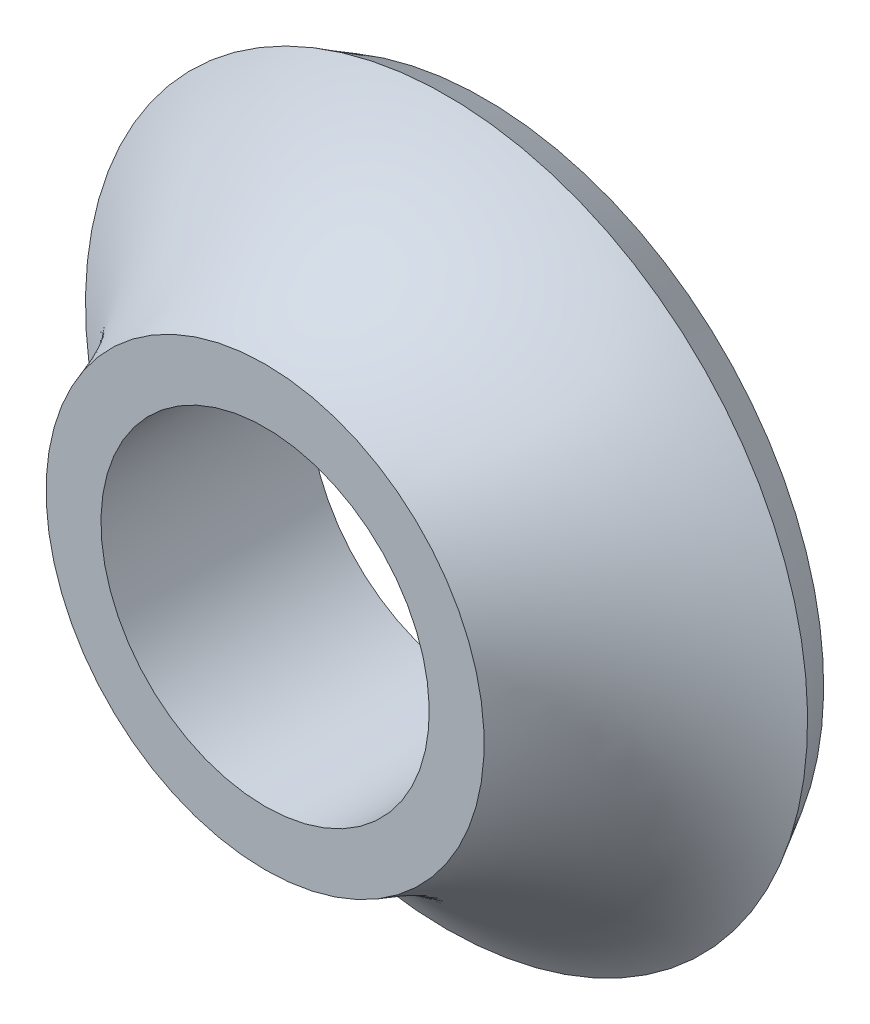
ISO-10303-21;
HEADER;
FILE_DESCRIPTION(('STEP AP214'),'2;1');
FILE_NAME('part.step','',(''),(''),'','','');
FILE_SCHEMA(('AUTOMOTIVE_DESIGN { 1 0 10303 214 1 1 1 1 }'));
ENDSEC;
DATA;
#1=APPLICATION_CONTEXT('core data for automotive mechanical design processes');
#2=APPLICATION_PROTOCOL_DEFINITION('international standard','automotive_design',2000,#1);
#3=PRODUCT_CONTEXT('',#1,'mechanical');
#4=PRODUCT('Part','Part','',(#3));
#5=PRODUCT_RELATED_PRODUCT_CATEGORY('part','',(#4));
#6=PRODUCT_DEFINITION_FORMATION('','',#4);
#7=PRODUCT_DEFINITION_CONTEXT('part definition',#1,'design');
#8=PRODUCT_DEFINITION('design','',#6,#7);
#9=PRODUCT_DEFINITION_SHAPE('','',#8);
#10=(LENGTH_UNIT() NAMED_UNIT(*) SI_UNIT(.MILLI.,.METRE.));
#11=(NAMED_UNIT(*) PLANE_ANGLE_UNIT() SI_UNIT($,.RADIAN.));
#12=(NAMED_UNIT(*) SI_UNIT($,.STERADIAN.) SOLID_ANGLE_UNIT());
#13=UNCERTAINTY_MEASURE_WITH_UNIT(LENGTH_MEASURE(1.E-05),#10,'distance_accuracy_value','');
#14=(GEOMETRIC_REPRESENTATION_CONTEXT(3) GLOBAL_UNCERTAINTY_ASSIGNED_CONTEXT((#13)) GLOBAL_UNIT_ASSIGNED_CONTEXT((#10,
#11,#12)) REPRESENTATION_CONTEXT('',''));
#15=CARTESIAN_POINT('',(0.,0.,0.));
#16=DIRECTION('',(0.,0.,1.));
#17=DIRECTION('',(1.,0.,0.));
#18=AXIS2_PLACEMENT_3D('',#15,#16,#17);
#19=CARTESIAN_POINT('',(0.,7.12470000000001,-4.28624999999999));
#20=DIRECTION('',(0.,0.,1.));
#21=DIRECTION('',(0.,-1.,0.));
#22=AXIS2_PLACEMENT_3D('',#19,#20,#21);
#23=PLANE('',#22);
#24=CARTESIAN_POINT('',(0.,0.,-4.28624999999999));
#25=DIRECTION('',(0.,0.,1.));
#26=DIRECTION('',(0.,-1.,0.));
#27=AXIS2_PLACEMENT_3D('',#24,#25,#26);
#28=CIRCLE('',#27,9.50595000000001);
#29=CARTESIAN_POINT('',(-9.47009203835951,-0.824889197104679,-4.28624999999999));
#30=VERTEX_POINT('',#29);
#31=CARTESIAN_POINT('',(9.47009203835951,-0.824889197104679,-4.28624999999999));
#32=VERTEX_POINT('',#31);
#33=EDGE_CURVE('E86',#30,#32,#28,.T.);
#34=ORIENTED_EDGE('',*,*,#33,.F.);
#35=DIRECTION('',(1.,0.,0.));
#36=VECTOR('',#35,1.);
#37=CARTESIAN_POINT('',(-15.6728,-0.824889197104679,-4.28624999999999));
#38=LINE('',#37,#36);
#39=CARTESIAN_POINT('',(-7.0767865519952,-0.824889197104679,-4.28624999999999));
#40=VERTEX_POINT('',#39);
#41=EDGE_CURVE('E49',#40,#30,#38,.F.);
#42=ORIENTED_EDGE('',*,*,#41,.F.);
#43=CARTESIAN_POINT('',(0.,0.,-4.28624999999999));
#44=DIRECTION('',(0.,0.,1.));
#45=DIRECTION('',(0.,-1.,0.));
#46=AXIS2_PLACEMENT_3D('',#43,#44,#45);
#47=CIRCLE('',#46,7.12470000000001);
#48=CARTESIAN_POINT('',(7.0767865519952,-0.824889197104679,-4.28624999999999));
#49=VERTEX_POINT('',#48);
#50=EDGE_CURVE('E42',#40,#49,#47,.T.);
#51=ORIENTED_EDGE('',*,*,#50,.T.);
#52=DIRECTION('',(-1.,0.,0.));
#53=VECTOR('',#52,1.);
#54=CARTESIAN_POINT('',(15.6728,-0.824889197104679,-4.28624999999999));
#55=LINE('',#54,#53);
#56=EDGE_CURVE('E121',#49,#32,#55,.F.);
#57=ORIENTED_EDGE('',*,*,#56,.T.);
#58=EDGE_LOOP('',(#34,#42,#51,#57));
#59=FACE_BOUND('',#58,.T.);
#60=ADVANCED_FACE('F34',(#59),#23,.F.);
#61=CARTESIAN_POINT('',(0.,0.,4.7625));
#62=DIRECTION('',(0.,0.,1.));
#63=DIRECTION('',(0.,-1.,0.));
#64=AXIS2_PLACEMENT_3D('',#61,#62,#63);
#65=CYLINDRICAL_SURFACE('',#64,7.12470000000001);
#66=CARTESIAN_POINT('',(0.,0.,4.76250000000001));
#67=DIRECTION('',(0.,0.,1.));
#68=DIRECTION('',(0.,-1.,0.));
#69=AXIS2_PLACEMENT_3D('',#66,#67,#68);
#70=CIRCLE('',#69,7.12470000000001);
#71=CARTESIAN_POINT('',(0.,-7.12470000000001,4.76250000000001));
#72=VERTEX_POINT('',#71);
#73=EDGE_CURVE('E110',#72,#72,#70,.T.);
#74=ORIENTED_EDGE('',*,*,#73,.T.);
#75=EDGE_LOOP('',(#74));
#76=FACE_BOUND('',#75,.T.);
#77=ORIENTED_EDGE('',*,*,#50,.F.);
#78=CARTESIAN_POINT('',(-7.0767865519952,0.824889197104678,-4.28624999999999));
#79=CARTESIAN_POINT('',(-7.07991081318576,0.798082774040599,-4.2397349698382));
#80=CARTESIAN_POINT('',(-7.08334681280521,0.76729135752586,-4.19556028833782));
#81=CARTESIAN_POINT('',(-7.09043354199789,0.698775085538407,-4.11302111180607));
#82=CARTESIAN_POINT('',(-7.09408415020311,0.661054123777355,-4.07465337582417));
#83=CARTESIAN_POINT('',(-7.10119732826127,0.579665064266609,-4.00478759663962));
#84=CARTESIAN_POINT('',(-7.1046598145341,0.535994352859709,-3.97329258845608));
#85=CARTESIAN_POINT('',(-7.11100387647174,0.443957788867563,-3.91808603529727));
#86=CARTESIAN_POINT('',(-7.11388559299483,0.395593078977948,-3.89437260212177));
#87=CARTESIAN_POINT('',(-7.11873967644817,0.295622025028616,-3.85545228237179));
#88=CARTESIAN_POINT('',(-7.12071386786302,0.244022423955394,-3.84022831535802));
#89=CARTESIAN_POINT('',(-7.12353844302164,0.138961209590835,-3.81866650636531));
#90=CARTESIAN_POINT('',(-7.12438870738319,0.0854993991166969,-3.8123296083561));
#91=CARTESIAN_POINT('',(-7.12486671276735,-0.0213082166584759,-3.80875215055316));
#92=CARTESIAN_POINT('',(-7.12450407268067,-0.0746515933911835,-3.8114400208478));
#93=CARTESIAN_POINT('',(-7.12261826402832,-0.180113951467322,-3.8256723984864));
#94=CARTESIAN_POINT('',(-7.12109526330009,-0.232233108761129,-3.83721562497134));
#95=CARTESIAN_POINT('',(-7.11706188536301,-0.333700959419785,-3.86878914797741));
#96=CARTESIAN_POINT('',(-7.11455305814696,-0.383053863585536,-3.88880612521281));
#97=CARTESIAN_POINT('',(-7.10882373359618,-0.477732406803024,-3.9367610291158));
#98=CARTESIAN_POINT('',(-7.10560289096084,-0.523056076823417,-3.96470280087641));
#99=CARTESIAN_POINT('',(-7.09877745248453,-0.608747607174028,-4.02796380476447));
#100=CARTESIAN_POINT('',(-7.09517000211386,-0.649073080323564,-4.06334007303277));
#101=CARTESIAN_POINT('',(-7.08800172754123,-0.723165983903717,-4.14030267712273));
#102=CARTESIAN_POINT('',(-7.08444082853355,-0.756945581303448,-4.18187723241364));
#103=CARTESIAN_POINT('',(-7.07961268763625,-0.800383569253792,-4.2455742833897));
#104=CARTESIAN_POINT('',(-7.07816897319162,-0.813027000031528,-4.26569212193168));
#105=CARTESIAN_POINT('',(-7.0767865519952,-0.824889197104679,-4.28624999999999));
#106=B_SPLINE_CURVE_WITH_KNOTS('',3,(#78,#79,#80,#81,#82,#83,#84,#85,#86,#87,#88,#89,#90,#91,
#92,#93,#94,#95,#96,#97,#98,#99,#100,#101,#102,#103,#104,#105),.UNSPECIFIED.,.F.,.F.,(4,2,2,2,2,
2,2,2,2,2,2,2,2,4),(0.,0.161113920974478,0.322137587408594,0.483232219161839,0.644287732326372,
0.805018028717101,0.965765396320857,1.12524099558217,1.28469353227525,1.44389636206881,
1.60317656926386,1.76372653079352,1.92397515020032,1.99531852447026),.UNSPECIFIED.);
#107=CARTESIAN_POINT('',(-7.0767865519952,0.824889197104678,-4.28624999999999));
#108=VERTEX_POINT('',#107);
#109=EDGE_CURVE('E74',#108,#40,#106,.T.);
#110=ORIENTED_EDGE('',*,*,#109,.F.);
#111=CARTESIAN_POINT('',(7.0767865519952,0.824889197104678,-4.28624999999999));
#112=VERTEX_POINT('',#111);
#113=EDGE_CURVE('E11',#112,#108,#47,.T.);
#114=ORIENTED_EDGE('',*,*,#113,.F.);
#115=CARTESIAN_POINT('',(7.0767865519952,0.824889197104678,-4.28624999999999));
#116=CARTESIAN_POINT('',(7.07991081318576,0.798082774040599,-4.2397349698382));
#117=CARTESIAN_POINT('',(7.08334681280521,0.76729135752586,-4.19556028833782));
#118=CARTESIAN_POINT('',(7.09043354199789,0.698775085538407,-4.11302111180607));
#119=CARTESIAN_POINT('',(7.09408415020311,0.661054123777355,-4.07465337582417));
#120=CARTESIAN_POINT('',(7.10119732826127,0.579665064266609,-4.00478759663962));
#121=CARTESIAN_POINT('',(7.1046598145341,0.535994352859709,-3.97329258845608));
#122=CARTESIAN_POINT('',(7.11100387647174,0.443957788867563,-3.91808603529727));
#123=CARTESIAN_POINT('',(7.11388559299483,0.395593078977948,-3.89437260212177));
#124=CARTESIAN_POINT('',(7.11873967644817,0.295622025028616,-3.85545228237179));
#125=CARTESIAN_POINT('',(7.12071386786302,0.244022423955394,-3.84022831535802));
#126=CARTESIAN_POINT('',(7.12353844302164,0.138961209590835,-3.81866650636531));
#127=CARTESIAN_POINT('',(7.12438870738319,0.0854993991166969,-3.8123296083561));
#128=CARTESIAN_POINT('',(7.12486671276735,-0.0213082166584759,-3.80875215055316));
#129=CARTESIAN_POINT('',(7.12450407268067,-0.0746515933911835,-3.8114400208478));
#130=CARTESIAN_POINT('',(7.12261826402832,-0.180113951467322,-3.8256723984864));
#131=CARTESIAN_POINT('',(7.12109526330009,-0.232233108761129,-3.83721562497134));
#132=CARTESIAN_POINT('',(7.11706188536301,-0.333700959419785,-3.86878914797741));
#133=CARTESIAN_POINT('',(7.11455305814696,-0.383053863585536,-3.88880612521281));
#134=CARTESIAN_POINT('',(7.10882373359618,-0.477732406803024,-3.9367610291158));
#135=CARTESIAN_POINT('',(7.10560289096084,-0.523056076823417,-3.96470280087641));
#136=CARTESIAN_POINT('',(7.09877745248453,-0.608747607174028,-4.02796380476447));
#137=CARTESIAN_POINT('',(7.09517000211386,-0.649073080323564,-4.06334007303277));
#138=CARTESIAN_POINT('',(7.08800172754123,-0.723165983903717,-4.14030267712273));
#139=CARTESIAN_POINT('',(7.08444082853355,-0.756945581303448,-4.18187723241364));
#140=CARTESIAN_POINT('',(7.07961268763625,-0.800383569253792,-4.2455742833897));
#141=CARTESIAN_POINT('',(7.07816897319162,-0.813027000031528,-4.26569212193168));
#142=CARTESIAN_POINT('',(7.0767865519952,-0.824889197104679,-4.28624999999999));
#143=B_SPLINE_CURVE_WITH_KNOTS('',3,(#115,#116,#117,#118,#119,#120,#121,#122,#123,#124,#125,
#126,#127,#128,#129,#130,#131,#132,#133,#134,#135,#136,#137,#138,#139,#140,#141,#142),
.UNSPECIFIED.,.F.,.F.,(4,2,2,2,2,2,2,2,2,2,2,2,2,4),(0.,0.161113920974478,0.322137587408594,
0.483232219161839,0.644287732326372,0.805018028717101,0.965765396320857,1.12524099558217,
1.28469353227525,1.44389636206881,1.60317656926386,1.76372653079352,1.92397515020032,
1.99531852447026),.UNSPECIFIED.);
#144=EDGE_CURVE('E89',#112,#49,#143,.T.);
#145=ORIENTED_EDGE('',*,*,#144,.T.);
#146=EDGE_LOOP('',(#77,#110,#114,#145));
#147=FACE_BOUND('',#146,.T.);
#148=ADVANCED_FACE('F36',(#76,#147),#65,.F.);
#149=ORIENTED_EDGE('',*,*,#113,.T.);
#150=DIRECTION('',(1.,0.,0.));
#151=VECTOR('',#150,1.);
#152=CARTESIAN_POINT('',(-15.6728,0.824889197104678,-4.28624999999999));
#153=LINE('',#152,#151);
#154=CARTESIAN_POINT('',(-9.47009203835951,0.824889197104678,-4.28624999999999));
#155=VERTEX_POINT('',#154);
#156=EDGE_CURVE('E77',#155,#108,#153,.T.);
#157=ORIENTED_EDGE('',*,*,#156,.F.);
#158=CARTESIAN_POINT('',(9.47009203835951,0.824889197104679,-4.28624999999999));
#159=VERTEX_POINT('',#158);
#160=EDGE_CURVE('E90',#159,#155,#28,.T.);
#161=ORIENTED_EDGE('',*,*,#160,.F.);
#162=DIRECTION('',(-1.,0.,0.));
#163=VECTOR('',#162,1.);
#164=CARTESIAN_POINT('',(15.6728,0.824889197104678,-4.28624999999999));
#165=LINE('',#164,#163);
#166=EDGE_CURVE('E57',#159,#112,#165,.T.);
#167=ORIENTED_EDGE('',*,*,#166,.T.);
#168=EDGE_LOOP('',(#149,#157,#161,#167));
#169=FACE_BOUND('',#168,.T.);
#170=ADVANCED_FACE('F152',(#169),#23,.F.);
#171=CARTESIAN_POINT('',(0.,0.,4.7625));
#172=DIRECTION('',(0.,0.,1.));
#173=DIRECTION('',(0.,-1.,0.));
#174=AXIS2_PLACEMENT_3D('',#171,#172,#173);
#175=CYLINDRICAL_SURFACE('',#174,9.50595);
#176=CARTESIAN_POINT('',(0.,0.,-2.85749999999998));
#177=DIRECTION('',(0.,0.,1.));
#178=DIRECTION('',(0.,-1.,0.));
#179=AXIS2_PLACEMENT_3D('',#176,#177,#178);
#180=CIRCLE('',#179,9.50594999999999);
#181=CARTESIAN_POINT('',(0.,-9.50594999999999,-2.85749999999998));
#182=VERTEX_POINT('',#181);
#183=EDGE_CURVE('E94',#182,#182,#180,.T.);
#184=ORIENTED_EDGE('',*,*,#183,.F.);
#185=EDGE_LOOP('',(#184));
#186=FACE_BOUND('',#185,.T.);
#187=ORIENTED_EDGE('',*,*,#160,.T.);
#188=CARTESIAN_POINT('',(-9.4700920383595,-0.824889197104679,-4.28624999999999));
#189=CARTESIAN_POINT('',(-9.47242458153636,-0.798106259553264,-4.23977297080377));
#190=CARTESIAN_POINT('',(-9.47499118202288,-0.76733804840804,-4.1956259664716));
#191=CARTESIAN_POINT('',(-9.48028671264905,-0.698875287721102,-4.1131324937354));
#192=CARTESIAN_POINT('',(-9.48301553801854,-0.661185176400797,-4.07478233703947));
#193=CARTESIAN_POINT('',(-9.4883346916603,-0.579867630286442,-4.0049450461167));
#194=CARTESIAN_POINT('',(-9.49092495684635,-0.53623752253574,-3.9734610182902));
#195=CARTESIAN_POINT('',(-9.49567261280733,-0.444300266048105,-3.91826905728397));
#196=CARTESIAN_POINT('',(-9.49783009920498,-0.395994153981738,-3.89455940561507));
#197=CARTESIAN_POINT('',(-9.50146793253557,-0.296115605986244,-3.8556141006093));
#198=CARTESIAN_POINT('',(-9.50294902956747,-0.244546860876587,-3.84036905616342));
#199=CARTESIAN_POINT('',(-9.50507049128155,-0.139556646911386,-3.8187559492861));
#200=CARTESIAN_POINT('',(-9.50571074682187,-0.0861349384633409,-3.81238903923654));
#201=CARTESIAN_POINT('',(-9.50607692844332,0.0207816072671138,-3.80873228862739));
#202=CARTESIAN_POINT('',(-9.50580692651574,0.0742750516244566,-3.81140202330426));
#203=CARTESIAN_POINT('',(-9.50439203015307,0.180042147654559,-3.82564994715988));
#204=CARTESIAN_POINT('',(-9.50324726038734,0.2323159720501,-3.83722686691417));
#205=CARTESIAN_POINT('',(-9.50021268605263,0.334121731868776,-3.8689346769462));
#206=CARTESIAN_POINT('',(-9.49832359745843,0.383656250221029,-3.88905734834266));
#207=CARTESIAN_POINT('',(-9.49400984379969,0.478673193304012,-3.93729232538895));
#208=CARTESIAN_POINT('',(-9.49158492777408,0.524153705238921,-3.96540837660644));
#209=CARTESIAN_POINT('',(-9.48645741584938,0.609976130630795,-4.02897913116839));
#210=CARTESIAN_POINT('',(-9.48375353546609,0.65029216669542,-4.06446862042355));
#211=CARTESIAN_POINT('',(-9.47838601628016,0.724336958743214,-4.14166072650167));
#212=CARTESIAN_POINT('',(-9.47572231070805,0.75807810036643,-4.18335139512137));
#213=CARTESIAN_POINT('',(-9.47214609705948,0.801062870371068,-4.24665664718209));
#214=CARTESIAN_POINT('',(-9.4710972672752,0.813346415138341,-4.26624581118117));
#215=CARTESIAN_POINT('',(-9.4700920383595,0.824889197104679,-4.28624999999999));
#216=B_SPLINE_CURVE_WITH_KNOTS('',3,(#188,#189,#190,#191,#192,#193,#194,#195,#196,#197,#198,
#199,#200,#201,#202,#203,#204,#205,#206,#207,#208,#209,#210,#211,#212,#213,#214,#215),
.UNSPECIFIED.,.F.,.F.,(4,2,2,2,2,2,2,2,2,2,2,2,2,4),(0.,0.160861388218397,0.321619992294214,
0.482451177200031,0.643246787127761,0.803863643110276,0.964501345221199,1.12442139786493,
1.28431866341809,1.44406249471029,1.60388130308512,1.76447194895507,1.92475708949603,
1.99412834238134),.UNSPECIFIED.);
#217=EDGE_CURVE('E138',#30,#155,#216,.T.);
#218=ORIENTED_EDGE('',*,*,#217,.F.);
#219=ORIENTED_EDGE('',*,*,#33,.T.);
#220=CARTESIAN_POINT('',(9.4700920383595,-0.824889197104679,-4.28624999999999));
#221=CARTESIAN_POINT('',(9.47242458153636,-0.798106259553264,-4.23977297080377));
#222=CARTESIAN_POINT('',(9.47499118202288,-0.76733804840804,-4.1956259664716));
#223=CARTESIAN_POINT('',(9.48028671264905,-0.698875287721102,-4.1131324937354));
#224=CARTESIAN_POINT('',(9.48301553801854,-0.661185176400797,-4.07478233703947));
#225=CARTESIAN_POINT('',(9.4883346916603,-0.579867630286442,-4.0049450461167));
#226=CARTESIAN_POINT('',(9.49092495684635,-0.53623752253574,-3.9734610182902));
#227=CARTESIAN_POINT('',(9.49567261280733,-0.444300266048105,-3.91826905728397));
#228=CARTESIAN_POINT('',(9.49783009920498,-0.395994153981738,-3.89455940561507));
#229=CARTESIAN_POINT('',(9.50146793253557,-0.296115605986244,-3.8556141006093));
#230=CARTESIAN_POINT('',(9.50294902956747,-0.244546860876587,-3.84036905616342));
#231=CARTESIAN_POINT('',(9.50507049128155,-0.139556646911386,-3.8187559492861));
#232=CARTESIAN_POINT('',(9.50571074682187,-0.0861349384633409,-3.81238903923654));
#233=CARTESIAN_POINT('',(9.50607692844332,0.0207816072671138,-3.80873228862739));
#234=CARTESIAN_POINT('',(9.50580692651574,0.0742750516244566,-3.81140202330426));
#235=CARTESIAN_POINT('',(9.50439203015307,0.180042147654559,-3.82564994715988));
#236=CARTESIAN_POINT('',(9.50324726038734,0.2323159720501,-3.83722686691417));
#237=CARTESIAN_POINT('',(9.50021268605263,0.334121731868776,-3.8689346769462));
#238=CARTESIAN_POINT('',(9.49832359745843,0.383656250221029,-3.88905734834266));
#239=CARTESIAN_POINT('',(9.49400984379969,0.478673193304012,-3.93729232538895));
#240=CARTESIAN_POINT('',(9.49158492777408,0.524153705238921,-3.96540837660644));
#241=CARTESIAN_POINT('',(9.48645741584938,0.609976130630795,-4.02897913116839));
#242=CARTESIAN_POINT('',(9.48375353546609,0.65029216669542,-4.06446862042355));
#243=CARTESIAN_POINT('',(9.47838601628016,0.724336958743214,-4.14166072650167));
#244=CARTESIAN_POINT('',(9.47572231070805,0.75807810036643,-4.18335139512137));
#245=CARTESIAN_POINT('',(9.47214609705948,0.801062870371068,-4.24665664718209));
#246=CARTESIAN_POINT('',(9.4710972672752,0.813346415138341,-4.26624581118117));
#247=CARTESIAN_POINT('',(9.4700920383595,0.824889197104679,-4.28624999999999));
#248=B_SPLINE_CURVE_WITH_KNOTS('',3,(#220,#221,#222,#223,#224,#225,#226,#227,#228,#229,#230,
#231,#232,#233,#234,#235,#236,#237,#238,#239,#240,#241,#242,#243,#244,#245,#246,#247),
.UNSPECIFIED.,.F.,.F.,(4,2,2,2,2,2,2,2,2,2,2,2,2,4),(0.,0.160861388218397,0.321619992294214,
0.482451177200031,0.643246787127761,0.803863643110276,0.964501345221199,1.12442139786493,
1.28431866341809,1.44406249471029,1.60388130308512,1.76447194895507,1.92475708949603,
1.99412834238134),.UNSPECIFIED.);
#249=EDGE_CURVE('E113',#32,#159,#248,.T.);
#250=ORIENTED_EDGE('',*,*,#249,.T.);
#251=EDGE_LOOP('',(#187,#218,#219,#250));
#252=FACE_BOUND('',#251,.T.);
#253=ADVANCED_FACE('F154',(#186,#252),#175,.T.);
#254=CARTESIAN_POINT('',(0.,0.,-2.85749999999998));
#255=DIRECTION('',(0.,0.,1.));
#256=DIRECTION('',(0.,-1.,0.));
#257=AXIS2_PLACEMENT_3D('',#254,#255,#256);
#258=TOROIDAL_SURFACE('',#257,10.1438810705271,0.637931070527106);
#259=CARTESIAN_POINT('',(0.,0.,-2.30503548706011));
#260=DIRECTION('',(0.,0.,1.));
#261=DIRECTION('',(0.,-1.,0.));
#262=AXIS2_PLACEMENT_3D('',#259,#260,#261);
#263=CIRCLE('',#262,10.4628466057907);
#264=CARTESIAN_POINT('',(0.,-10.4628466057907,-2.30503548706011));
#265=VERTEX_POINT('',#264);
#266=EDGE_CURVE('E98',#265,#265,#263,.T.);
#267=ORIENTED_EDGE('',*,*,#266,.F.);
#268=EDGE_LOOP('',(#267));
#269=FACE_BOUND('',#268,.T.);
#270=ORIENTED_EDGE('',*,*,#183,.T.);
#271=EDGE_LOOP('',(#270));
#272=FACE_BOUND('',#271,.T.);
#273=ADVANCED_FACE('F159',(#269,#272),#258,.F.);
#274=CARTESIAN_POINT('',(0.,0.,-2.30503548706011));
#275=DIRECTION('',(0.,0.,-1.));
#276=DIRECTION('',(0.,1.,0.));
#277=AXIS2_PLACEMENT_3D('',#274,#275,#276);
#278=CONICAL_SURFACE('',#277,10.4628466057907,1.0471975511966);
#279=CARTESIAN_POINT('',(0.,0.,-4.76249999999999));
#280=DIRECTION('',(0.,0.,1.));
#281=DIRECTION('',(0.,-1.,0.));
#282=AXIS2_PLACEMENT_3D('',#279,#280,#281);
#283=CIRCLE('',#282,14.7193);
#284=CARTESIAN_POINT('',(0.,-14.7193,-4.76249999999999));
#285=VERTEX_POINT('',#284);
#286=EDGE_CURVE('E101',#285,#285,#283,.T.);
#287=ORIENTED_EDGE('',*,*,#286,.F.);
#288=EDGE_LOOP('',(#287));
#289=FACE_BOUND('',#288,.T.);
#290=ORIENTED_EDGE('',*,*,#266,.T.);
#291=EDGE_LOOP('',(#290));
#292=FACE_BOUND('',#291,.T.);
#293=ADVANCED_FACE('F219',(#289,#292),#278,.F.);
#294=CARTESIAN_POINT('',(0.,0.,-4.76249999999999));
#295=DIRECTION('',(0.,0.,1.));
#296=DIRECTION('',(0.,-1.,0.));
#297=AXIS2_PLACEMENT_3D('',#294,#295,#296);
#298=CONICAL_SURFACE('',#297,14.7193,0.523598775598288);
#299=CARTESIAN_POINT('',(0.,0.,-3.11272160579062));
#300=DIRECTION('',(0.,0.,1.));
#301=DIRECTION('',(0.,-1.,0.));
#302=AXIS2_PLACEMENT_3D('',#299,#300,#301);
#303=CIRCLE('',#302,15.6718);
#304=CARTESIAN_POINT('',(0.,-15.6718,-3.11272160579062));
#305=VERTEX_POINT('',#304);
#306=EDGE_CURVE('E104',#305,#305,#303,.T.);
#307=ORIENTED_EDGE('',*,*,#306,.F.);
#308=EDGE_LOOP('',(#307));
#309=FACE_BOUND('',#308,.T.);
#310=ORIENTED_EDGE('',*,*,#286,.T.);
#311=EDGE_LOOP('',(#310));
#312=FACE_BOUND('',#311,.T.);
#313=ADVANCED_FACE('F211',(#309,#312),#298,.T.);
#314=CARTESIAN_POINT('',(0.,0.,8.4780462648504));
#315=DIRECTION('',(0.,0.,1.));
#316=DIRECTION('',(0.,-1.,0.));
#317=AXIS2_PLACEMENT_3D('',#314,#315,#316);
#318=TOROIDAL_SURFACE('',#317,22.3637329502291,13.3838659004581);
#319=CARTESIAN_POINT('',(0.,0.,4.7625));
#320=DIRECTION('',(0.,0.,1.));
#321=DIRECTION('',(0.,-1.,0.));
#322=AXIS2_PLACEMENT_3D('',#319,#320,#321);
#323=CIRCLE('',#322,9.50595);
#324=CARTESIAN_POINT('',(0.,-9.50595,4.7625));
#325=VERTEX_POINT('',#324);
#326=EDGE_CURVE('E107',#325,#325,#323,.T.);
#327=ORIENTED_EDGE('',*,*,#326,.F.);
#328=EDGE_LOOP('',(#327));
#329=FACE_BOUND('',#328,.T.);
#330=ORIENTED_EDGE('',*,*,#306,.T.);
#331=EDGE_LOOP('',(#330));
#332=FACE_BOUND('',#331,.T.);
#333=ADVANCED_FACE('F205',(#329,#332),#318,.F.);
#334=CARTESIAN_POINT('',(0.,7.12470000000001,4.76250000000001));
#335=DIRECTION('',(0.,0.,-1.));
#336=DIRECTION('',(0.,1.,0.));
#337=AXIS2_PLACEMENT_3D('',#334,#335,#336);
#338=PLANE('',#337);
#339=ORIENTED_EDGE('',*,*,#73,.F.);
#340=EDGE_LOOP('',(#339));
#341=FACE_BOUND('',#340,.T.);
#342=ORIENTED_EDGE('',*,*,#326,.T.);
#343=EDGE_LOOP('',(#342));
#344=FACE_BOUND('',#343,.T.);
#345=ADVANCED_FACE('F192',(#341,#344),#338,.F.);
#346=CARTESIAN_POINT('',(15.6728,0.,-4.7625));
#347=DIRECTION('',(-1.,0.,0.));
#348=DIRECTION('',(0.,0.,1.));
#349=AXIS2_PLACEMENT_3D('',#346,#347,#348);
#350=CYLINDRICAL_SURFACE('',#349,0.952500000000006);
#351=ORIENTED_EDGE('',*,*,#166,.F.);
#352=ORIENTED_EDGE('',*,*,#249,.F.);
#353=ORIENTED_EDGE('',*,*,#56,.F.);
#354=ORIENTED_EDGE('',*,*,#144,.F.);
#355=EDGE_LOOP('',(#351,#352,#353,#354));
#356=FACE_BOUND('',#355,.T.);
#357=ADVANCED_FACE('F123',(#356),#350,.F.);
#358=CARTESIAN_POINT('',(-15.6728,0.,-4.7625));
#359=DIRECTION('',(1.,0.,0.));
#360=DIRECTION('',(0.,0.,-1.));
#361=AXIS2_PLACEMENT_3D('',#358,#359,#360);
#362=CYLINDRICAL_SURFACE('',#361,0.952500000000006);
#363=ORIENTED_EDGE('',*,*,#109,.T.);
#364=ORIENTED_EDGE('',*,*,#41,.T.);
#365=ORIENTED_EDGE('',*,*,#217,.T.);
#366=ORIENTED_EDGE('',*,*,#156,.T.);
#367=EDGE_LOOP('',(#363,#364,#365,#366));
#368=FACE_BOUND('',#367,.T.);
#369=ADVANCED_FACE('F75',(#368),#362,.F.);
#370=CLOSED_SHELL('',(#60,#148,#170,#253,#273,#293,#313,#333,#345,#357,#369));
#371=MANIFOLD_SOLID_BREP('B2',#370);
#372=ADVANCED_BREP_SHAPE_REPRESENTATION('',(#18,#371),#14);
#373=SHAPE_DEFINITION_REPRESENTATION(#9,#372);
ENDSEC;
END-ISO-10303-21;
